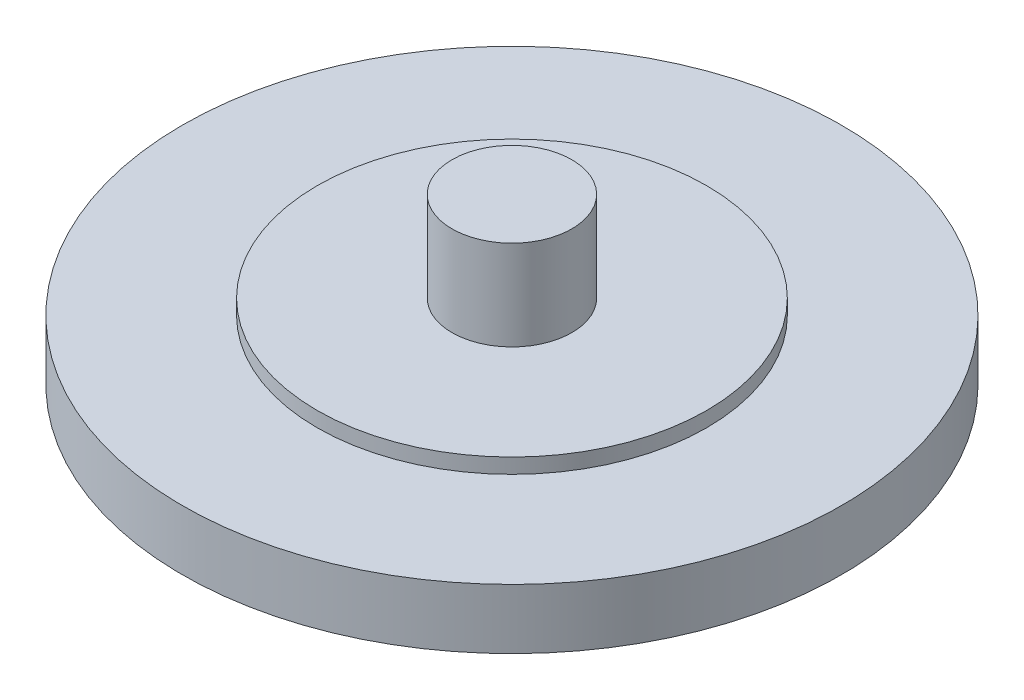
ISO-10303-21;
HEADER;
FILE_DESCRIPTION(('STEP AP214'),'2;1');
FILE_NAME('part.step','',(''),(''),'','','');
FILE_SCHEMA(('AUTOMOTIVE_DESIGN { 1 0 10303 214 1 1 1 1 }'));
ENDSEC;
DATA;
#1=APPLICATION_CONTEXT('core data for automotive mechanical design processes');
#2=APPLICATION_PROTOCOL_DEFINITION('international standard','automotive_design',2000,#1);
#3=PRODUCT_CONTEXT('',#1,'mechanical');
#4=PRODUCT('Part','Part','',(#3));
#5=PRODUCT_RELATED_PRODUCT_CATEGORY('part','',(#4));
#6=PRODUCT_DEFINITION_FORMATION('','',#4);
#7=PRODUCT_DEFINITION_CONTEXT('part definition',#1,'design');
#8=PRODUCT_DEFINITION('design','',#6,#7);
#9=PRODUCT_DEFINITION_SHAPE('','',#8);
#10=(LENGTH_UNIT() NAMED_UNIT(*) SI_UNIT(.MILLI.,.METRE.));
#11=(NAMED_UNIT(*) PLANE_ANGLE_UNIT() SI_UNIT($,.RADIAN.));
#12=(NAMED_UNIT(*) SI_UNIT($,.STERADIAN.) SOLID_ANGLE_UNIT());
#13=UNCERTAINTY_MEASURE_WITH_UNIT(LENGTH_MEASURE(1.E-05),#10,'distance_accuracy_value','');
#14=(GEOMETRIC_REPRESENTATION_CONTEXT(3) GLOBAL_UNCERTAINTY_ASSIGNED_CONTEXT((#13)) GLOBAL_UNIT_ASSIGNED_CONTEXT((#10,
#11,#12)) REPRESENTATION_CONTEXT('',''));
#15=CARTESIAN_POINT('',(0.,0.,0.));
#16=DIRECTION('',(0.,0.,1.));
#17=DIRECTION('',(1.,0.,0.));
#18=AXIS2_PLACEMENT_3D('',#15,#16,#17);
#19=CARTESIAN_POINT('',(0.,0.,0.));
#20=DIRECTION('',(0.,1.,0.));
#21=DIRECTION('',(-1.,0.,0.));
#22=AXIS2_PLACEMENT_3D('',#19,#20,#21);
#23=PLANE('',#22);
#24=CARTESIAN_POINT('',(0.,0.,0.));
#25=DIRECTION('',(0.,1.,0.));
#26=DIRECTION('',(-1.,0.,0.));
#27=AXIS2_PLACEMENT_3D('',#24,#25,#26);
#28=CIRCLE('',#27,11.);
#29=CARTESIAN_POINT('',(-11.,0.,0.));
#30=VERTEX_POINT('',#29);
#31=EDGE_CURVE('E10',#30,#30,#28,.T.);
#32=ORIENTED_EDGE('',*,*,#31,.F.);
#33=EDGE_LOOP('',(#32));
#34=FACE_BOUND('',#33,.T.);
#35=ADVANCED_FACE('F31',(#34),#23,.F.);
#36=CARTESIAN_POINT('',(0.,5.5,0.));
#37=DIRECTION('',(0.,1.,0.));
#38=DIRECTION('',(-1.,0.,0.));
#39=AXIS2_PLACEMENT_3D('',#36,#37,#38);
#40=CYLINDRICAL_SURFACE('',#39,11.);
#41=CARTESIAN_POINT('',(0.,2.,0.));
#42=DIRECTION('',(0.,1.,0.));
#43=DIRECTION('',(-1.,0.,0.));
#44=AXIS2_PLACEMENT_3D('',#41,#42,#43);
#45=CIRCLE('',#44,11.);
#46=CARTESIAN_POINT('',(-11.,2.,0.));
#47=VERTEX_POINT('',#46);
#48=EDGE_CURVE('E37',#47,#47,#45,.T.);
#49=ORIENTED_EDGE('',*,*,#48,.F.);
#50=EDGE_LOOP('',(#49));
#51=FACE_BOUND('',#50,.T.);
#52=ORIENTED_EDGE('',*,*,#31,.T.);
#53=EDGE_LOOP('',(#52));
#54=FACE_BOUND('',#53,.T.);
#55=ADVANCED_FACE('F79',(#51,#54),#40,.T.);
#56=CARTESIAN_POINT('',(11.,2.,0.));
#57=DIRECTION('',(0.,-1.,0.));
#58=DIRECTION('',(1.,0.,0.));
#59=AXIS2_PLACEMENT_3D('',#56,#57,#58);
#60=PLANE('',#59);
#61=CARTESIAN_POINT('',(0.,2.,0.));
#62=DIRECTION('',(0.,1.,0.));
#63=DIRECTION('',(-1.,0.,0.));
#64=AXIS2_PLACEMENT_3D('',#61,#62,#63);
#65=CIRCLE('',#64,6.5);
#66=CARTESIAN_POINT('',(-6.5,2.,0.));
#67=VERTEX_POINT('',#66);
#68=EDGE_CURVE('E41',#67,#67,#65,.T.);
#69=ORIENTED_EDGE('',*,*,#68,.F.);
#70=EDGE_LOOP('',(#69));
#71=FACE_BOUND('',#70,.T.);
#72=ORIENTED_EDGE('',*,*,#48,.T.);
#73=EDGE_LOOP('',(#72));
#74=FACE_BOUND('',#73,.T.);
#75=ADVANCED_FACE('F74',(#71,#74),#60,.F.);
#76=CARTESIAN_POINT('',(0.,5.5,0.));
#77=DIRECTION('',(0.,1.,0.));
#78=DIRECTION('',(-1.,0.,0.));
#79=AXIS2_PLACEMENT_3D('',#76,#77,#78);
#80=CYLINDRICAL_SURFACE('',#79,6.5);
#81=CARTESIAN_POINT('',(0.,2.5,0.));
#82=DIRECTION('',(0.,1.,0.));
#83=DIRECTION('',(-1.,0.,0.));
#84=AXIS2_PLACEMENT_3D('',#81,#82,#83);
#85=CIRCLE('',#84,6.5);
#86=CARTESIAN_POINT('',(-6.5,2.5,0.));
#87=VERTEX_POINT('',#86);
#88=EDGE_CURVE('E45',#87,#87,#85,.T.);
#89=ORIENTED_EDGE('',*,*,#88,.F.);
#90=EDGE_LOOP('',(#89));
#91=FACE_BOUND('',#90,.T.);
#92=ORIENTED_EDGE('',*,*,#68,.T.);
#93=EDGE_LOOP('',(#92));
#94=FACE_BOUND('',#93,.T.);
#95=ADVANCED_FACE('F68',(#91,#94),#80,.T.);
#96=CARTESIAN_POINT('',(6.5,2.5,0.));
#97=DIRECTION('',(0.,-1.,0.));
#98=DIRECTION('',(1.,0.,0.));
#99=AXIS2_PLACEMENT_3D('',#96,#97,#98);
#100=PLANE('',#99);
#101=CARTESIAN_POINT('',(0.,2.5,0.));
#102=DIRECTION('',(0.,1.,0.));
#103=DIRECTION('',(-1.,0.,0.));
#104=AXIS2_PLACEMENT_3D('',#101,#102,#103);
#105=CIRCLE('',#104,2.);
#106=CARTESIAN_POINT('',(-2.,2.5,0.));
#107=VERTEX_POINT('',#106);
#108=EDGE_CURVE('E50',#107,#107,#105,.T.);
#109=ORIENTED_EDGE('',*,*,#108,.F.);
#110=EDGE_LOOP('',(#109));
#111=FACE_BOUND('',#110,.T.);
#112=ORIENTED_EDGE('',*,*,#88,.T.);
#113=EDGE_LOOP('',(#112));
#114=FACE_BOUND('',#113,.T.);
#115=ADVANCED_FACE('F62',(#111,#114),#100,.F.);
#116=CARTESIAN_POINT('',(0.,5.5,0.));
#117=DIRECTION('',(0.,1.,0.));
#118=DIRECTION('',(-1.,0.,0.));
#119=AXIS2_PLACEMENT_3D('',#116,#117,#118);
#120=CYLINDRICAL_SURFACE('',#119,2.);
#121=CARTESIAN_POINT('',(0.,5.5,0.));
#122=DIRECTION('',(0.,1.,0.));
#123=DIRECTION('',(-1.,0.,0.));
#124=AXIS2_PLACEMENT_3D('',#121,#122,#123);
#125=CIRCLE('',#124,2.);
#126=CARTESIAN_POINT('',(-2.,5.5,0.));
#127=VERTEX_POINT('',#126);
#128=EDGE_CURVE('E53',#127,#127,#125,.T.);
#129=ORIENTED_EDGE('',*,*,#128,.F.);
#130=EDGE_LOOP('',(#129));
#131=FACE_BOUND('',#130,.T.);
#132=ORIENTED_EDGE('',*,*,#108,.T.);
#133=EDGE_LOOP('',(#132));
#134=FACE_BOUND('',#133,.T.);
#135=ADVANCED_FACE('F59',(#131,#134),#120,.T.);
#136=CARTESIAN_POINT('',(2.,5.5,0.));
#137=DIRECTION('',(0.,-1.,0.));
#138=DIRECTION('',(1.,0.,0.));
#139=AXIS2_PLACEMENT_3D('',#136,#137,#138);
#140=PLANE('',#139);
#141=ORIENTED_EDGE('',*,*,#128,.T.);
#142=EDGE_LOOP('',(#141));
#143=FACE_BOUND('',#142,.T.);
#144=ADVANCED_FACE('F57',(#143),#140,.F.);
#145=CLOSED_SHELL('',(#35,#55,#75,#95,#115,#135,#144));
#146=MANIFOLD_SOLID_BREP('B2',#145);
#147=ADVANCED_BREP_SHAPE_REPRESENTATION('',(#18,#146),#14);
#148=SHAPE_DEFINITION_REPRESENTATION(#9,#147);
ENDSEC;
END-ISO-10303-21;
